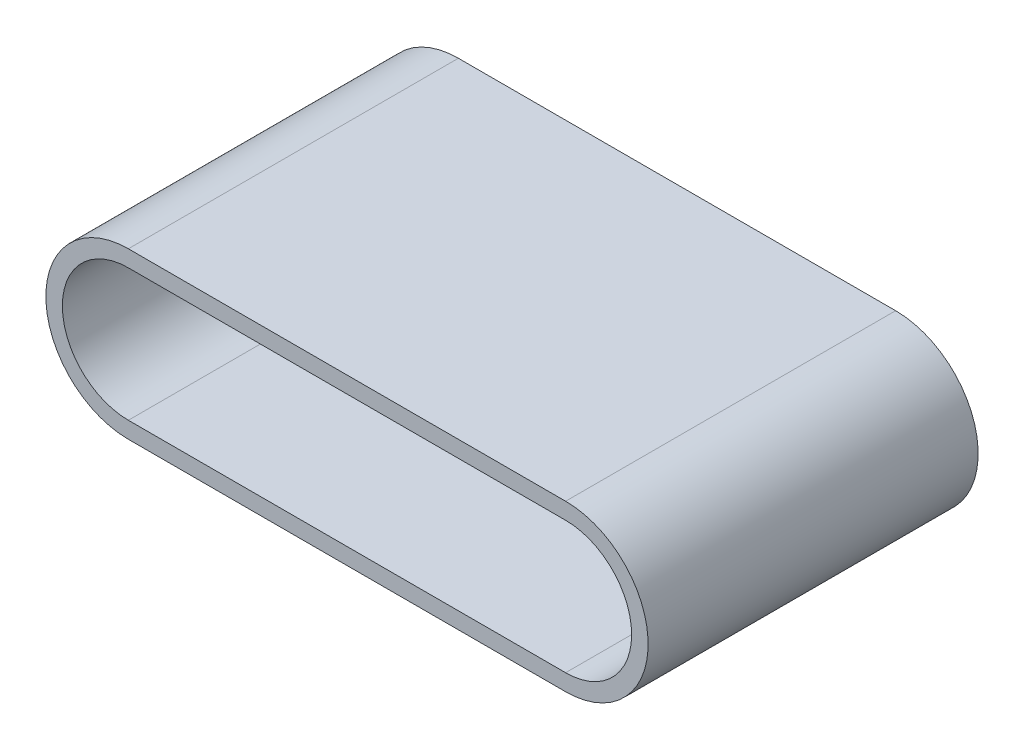
ISO-10303-21;
HEADER;
FILE_DESCRIPTION(('STEP AP214'),'2;1');
FILE_NAME('part.step','',(''),(''),'','','');
FILE_SCHEMA(('AUTOMOTIVE_DESIGN { 1 0 10303 214 1 1 1 1 }'));
ENDSEC;
DATA;
#1=APPLICATION_CONTEXT('core data for automotive mechanical design processes');
#2=APPLICATION_PROTOCOL_DEFINITION('international standard','automotive_design',2000,#1);
#3=PRODUCT_CONTEXT('',#1,'mechanical');
#4=PRODUCT('Part','Part','',(#3));
#5=PRODUCT_RELATED_PRODUCT_CATEGORY('part','',(#4));
#6=PRODUCT_DEFINITION_FORMATION('','',#4);
#7=PRODUCT_DEFINITION_CONTEXT('part definition',#1,'design');
#8=PRODUCT_DEFINITION('design','',#6,#7);
#9=PRODUCT_DEFINITION_SHAPE('','',#8);
#10=(LENGTH_UNIT() NAMED_UNIT(*) SI_UNIT(.MILLI.,.METRE.));
#11=(NAMED_UNIT(*) PLANE_ANGLE_UNIT() SI_UNIT($,.RADIAN.));
#12=(NAMED_UNIT(*) SI_UNIT($,.STERADIAN.) SOLID_ANGLE_UNIT());
#13=UNCERTAINTY_MEASURE_WITH_UNIT(LENGTH_MEASURE(1.E-05),#10,'distance_accuracy_value','');
#14=(GEOMETRIC_REPRESENTATION_CONTEXT(3) GLOBAL_UNCERTAINTY_ASSIGNED_CONTEXT((#13)) GLOBAL_UNIT_ASSIGNED_CONTEXT((#10,
#11,#12)) REPRESENTATION_CONTEXT('',''));
#15=CARTESIAN_POINT('',(0.,0.,0.));
#16=DIRECTION('',(0.,0.,1.));
#17=DIRECTION('',(1.,0.,0.));
#18=AXIS2_PLACEMENT_3D('',#15,#16,#17);
#19=CARTESIAN_POINT('',(57.4341991322256,0.,100.));
#20=DIRECTION('',(0.,0.,-1.));
#21=DIRECTION('',(-1.,0.,0.));
#22=AXIS2_PLACEMENT_3D('',#19,#20,#21);
#23=PLANE('',#22);
#24=CARTESIAN_POINT('',(57.4341991322256,0.,100.));
#25=DIRECTION('',(0.,0.,-1.));
#26=DIRECTION('',(-1.,0.,0.));
#27=AXIS2_PLACEMENT_3D('',#24,#25,#26);
#28=CIRCLE('',#27,50.);
#29=CARTESIAN_POINT('',(57.4341991322256,50.0000000000001,100.));
#30=VERTEX_POINT('',#29);
#31=CARTESIAN_POINT('',(57.4341991322256,-50.,100.));
#32=VERTEX_POINT('',#31);
#33=EDGE_CURVE('E160',#30,#32,#28,.F.);
#34=ORIENTED_EDGE('',*,*,#33,.T.);
#35=DIRECTION('',(1.,0.,0.));
#36=VECTOR('',#35,1.);
#37=CARTESIAN_POINT('',(57.4341991322256,-50.,100.));
#38=LINE('',#37,#36);
#39=CARTESIAN_POINT('',(322.434199132226,-49.9999999999999,100.));
#40=VERTEX_POINT('',#39);
#41=EDGE_CURVE('E163',#32,#40,#38,.T.);
#42=ORIENTED_EDGE('',*,*,#41,.T.);
#43=CARTESIAN_POINT('',(322.434199132226,1.02348685082632E-13,100.));
#44=DIRECTION('',(0.,0.,-1.));
#45=DIRECTION('',(-1.,0.,0.));
#46=AXIS2_PLACEMENT_3D('',#43,#44,#45);
#47=CIRCLE('',#46,50.);
#48=CARTESIAN_POINT('',(322.434199132226,50.0000000000001,100.));
#49=VERTEX_POINT('',#48);
#50=EDGE_CURVE('E166',#40,#49,#47,.F.);
#51=ORIENTED_EDGE('',*,*,#50,.T.);
#52=DIRECTION('',(-1.,0.,0.));
#53=VECTOR('',#52,1.);
#54=CARTESIAN_POINT('',(57.4341991322256,50.0000000000001,100.));
#55=LINE('',#54,#53);
#56=EDGE_CURVE('E168',#49,#30,#55,.T.);
#57=ORIENTED_EDGE('',*,*,#56,.T.);
#58=EDGE_LOOP('',(#34,#42,#51,#57));
#59=FACE_BOUND('',#58,.T.);
#60=CARTESIAN_POINT('',(57.4341991322256,0.,100.));
#61=DIRECTION('',(0.,0.,1.));
#62=DIRECTION('',(-1.,0.,0.));
#63=AXIS2_PLACEMENT_3D('',#60,#61,#62);
#64=CIRCLE('',#63,40.);
#65=CARTESIAN_POINT('',(57.4341991322256,40.0000000000001,100.));
#66=VERTEX_POINT('',#65);
#67=CARTESIAN_POINT('',(57.4341991322256,-39.9999999999999,100.));
#68=VERTEX_POINT('',#67);
#69=EDGE_CURVE('E124',#66,#68,#64,.T.);
#70=ORIENTED_EDGE('',*,*,#69,.F.);
#71=DIRECTION('',(-1.,0.,0.));
#72=VECTOR('',#71,1.);
#73=CARTESIAN_POINT('',(57.4341991322256,40.0000000000001,100.));
#74=LINE('',#73,#72);
#75=CARTESIAN_POINT('',(322.434199132226,40.0000000000001,100.));
#76=VERTEX_POINT('',#75);
#77=EDGE_CURVE('E146',#76,#66,#74,.T.);
#78=ORIENTED_EDGE('',*,*,#77,.F.);
#79=CARTESIAN_POINT('',(322.434199132226,1.02348685082632E-13,100.));
#80=DIRECTION('',(0.,0.,1.));
#81=DIRECTION('',(-1.,0.,0.));
#82=AXIS2_PLACEMENT_3D('',#79,#80,#81);
#83=CIRCLE('',#82,40.);
#84=CARTESIAN_POINT('',(322.434199132226,-39.9999999999999,100.));
#85=VERTEX_POINT('',#84);
#86=EDGE_CURVE('E144',#85,#76,#83,.T.);
#87=ORIENTED_EDGE('',*,*,#86,.F.);
#88=DIRECTION('',(1.,0.,0.));
#89=VECTOR('',#88,1.);
#90=CARTESIAN_POINT('',(322.434199132226,-39.9999999999999,100.));
#91=LINE('',#90,#89);
#92=EDGE_CURVE('E132',#68,#85,#91,.T.);
#93=ORIENTED_EDGE('',*,*,#92,.F.);
#94=EDGE_LOOP('',(#70,#78,#87,#93));
#95=FACE_BOUND('',#94,.T.);
#96=ADVANCED_FACE('F59',(#59,#95),#23,.F.);
#97=CARTESIAN_POINT('',(57.4341991322256,0.,-100.));
#98=DIRECTION('',(0.,0.,-1.));
#99=DIRECTION('',(-1.,0.,0.));
#100=AXIS2_PLACEMENT_3D('',#97,#98,#99);
#101=PLANE('',#100);
#102=CARTESIAN_POINT('',(57.4341991322256,0.,-100.));
#103=DIRECTION('',(0.,0.,-1.));
#104=DIRECTION('',(-1.,0.,0.));
#105=AXIS2_PLACEMENT_3D('',#102,#103,#104);
#106=CIRCLE('',#105,50.);
#107=CARTESIAN_POINT('',(57.4341991322256,50.0000000000001,-100.));
#108=VERTEX_POINT('',#107);
#109=CARTESIAN_POINT('',(57.4341991322256,-50.,-100.));
#110=VERTEX_POINT('',#109);
#111=EDGE_CURVE('E140',#108,#110,#106,.F.);
#112=ORIENTED_EDGE('',*,*,#111,.F.);
#113=DIRECTION('',(-1.,0.,0.));
#114=VECTOR('',#113,1.);
#115=CARTESIAN_POINT('',(57.4341991322256,50.0000000000001,-100.));
#116=LINE('',#115,#114);
#117=CARTESIAN_POINT('',(322.434199132226,50.0000000000001,-100.));
#118=VERTEX_POINT('',#117);
#119=EDGE_CURVE('E164',#118,#108,#116,.T.);
#120=ORIENTED_EDGE('',*,*,#119,.F.);
#121=CARTESIAN_POINT('',(322.434199132226,1.02348685082632E-13,-100.));
#122=DIRECTION('',(0.,0.,-1.));
#123=DIRECTION('',(-1.,0.,0.));
#124=AXIS2_PLACEMENT_3D('',#121,#122,#123);
#125=CIRCLE('',#124,50.);
#126=CARTESIAN_POINT('',(322.434199132226,-49.9999999999999,-100.));
#127=VERTEX_POINT('',#126);
#128=EDGE_CURVE('E175',#127,#118,#125,.F.);
#129=ORIENTED_EDGE('',*,*,#128,.F.);
#130=DIRECTION('',(1.,0.,0.));
#131=VECTOR('',#130,1.);
#132=CARTESIAN_POINT('',(57.4341991322256,-50.,-100.));
#133=LINE('',#132,#131);
#134=EDGE_CURVE('E173',#110,#127,#133,.T.);
#135=ORIENTED_EDGE('',*,*,#134,.F.);
#136=EDGE_LOOP('',(#112,#120,#129,#135));
#137=FACE_BOUND('',#136,.T.);
#138=DIRECTION('',(-1.,0.,0.));
#139=VECTOR('',#138,1.);
#140=CARTESIAN_POINT('',(57.4341991322256,40.0000000000001,-100.));
#141=LINE('',#140,#139);
#142=CARTESIAN_POINT('',(322.434199132226,40.0000000000001,-100.));
#143=VERTEX_POINT('',#142);
#144=CARTESIAN_POINT('',(57.4341991322256,40.0000000000001,-100.));
#145=VERTEX_POINT('',#144);
#146=EDGE_CURVE('E133',#143,#145,#141,.T.);
#147=ORIENTED_EDGE('',*,*,#146,.T.);
#148=CARTESIAN_POINT('',(57.4341991322256,0.,-100.));
#149=DIRECTION('',(0.,0.,1.));
#150=DIRECTION('',(-1.,0.,0.));
#151=AXIS2_PLACEMENT_3D('',#148,#149,#150);
#152=CIRCLE('',#151,40.);
#153=CARTESIAN_POINT('',(57.4341991322256,-39.9999999999999,-100.));
#154=VERTEX_POINT('',#153);
#155=EDGE_CURVE('E82',#145,#154,#152,.T.);
#156=ORIENTED_EDGE('',*,*,#155,.T.);
#157=DIRECTION('',(1.,0.,0.));
#158=VECTOR('',#157,1.);
#159=CARTESIAN_POINT('',(322.434199132226,-39.9999999999999,-100.));
#160=LINE('',#159,#158);
#161=CARTESIAN_POINT('',(322.434199132226,-39.9999999999999,-100.));
#162=VERTEX_POINT('',#161);
#163=EDGE_CURVE('E139',#154,#162,#160,.T.);
#164=ORIENTED_EDGE('',*,*,#163,.T.);
#165=CARTESIAN_POINT('',(322.434199132226,1.02348685082632E-13,-100.));
#166=DIRECTION('',(0.,0.,1.));
#167=DIRECTION('',(-1.,0.,0.));
#168=AXIS2_PLACEMENT_3D('',#165,#166,#167);
#169=CIRCLE('',#168,40.);
#170=EDGE_CURVE('E152',#162,#143,#169,.T.);
#171=ORIENTED_EDGE('',*,*,#170,.T.);
#172=EDGE_LOOP('',(#147,#156,#164,#171));
#173=FACE_BOUND('',#172,.T.);
#174=ADVANCED_FACE('F193',(#137,#173),#101,.T.);
#175=CARTESIAN_POINT('',(57.4341991322256,0.,100.));
#176=DIRECTION('',(0.,0.,-1.));
#177=DIRECTION('',(-1.,0.,0.));
#178=AXIS2_PLACEMENT_3D('',#175,#176,#177);
#179=CYLINDRICAL_SURFACE('',#178,50.);
#180=ORIENTED_EDGE('',*,*,#111,.T.);
#181=DIRECTION('',(0.,0.,-1.));
#182=VECTOR('',#181,1.);
#183=CARTESIAN_POINT('',(57.4341991322256,-50.,100.));
#184=LINE('',#183,#182);
#185=EDGE_CURVE('E12',#32,#110,#184,.T.);
#186=ORIENTED_EDGE('',*,*,#185,.F.);
#187=ORIENTED_EDGE('',*,*,#33,.F.);
#188=DIRECTION('',(0.,0.,-1.));
#189=VECTOR('',#188,1.);
#190=CARTESIAN_POINT('',(57.4341991322256,50.0000000000001,100.));
#191=LINE('',#190,#189);
#192=EDGE_CURVE('E170',#30,#108,#191,.T.);
#193=ORIENTED_EDGE('',*,*,#192,.T.);
#194=EDGE_LOOP('',(#180,#186,#187,#193));
#195=FACE_BOUND('',#194,.T.);
#196=ADVANCED_FACE('F61',(#195),#179,.T.);
#197=CARTESIAN_POINT('',(57.4341991322256,-50.,100.));
#198=DIRECTION('',(0.,1.,0.));
#199=DIRECTION('',(-1.,0.,0.));
#200=AXIS2_PLACEMENT_3D('',#197,#198,#199);
#201=PLANE('',#200);
#202=ORIENTED_EDGE('',*,*,#134,.T.);
#203=DIRECTION('',(0.,0.,-1.));
#204=VECTOR('',#203,1.);
#205=CARTESIAN_POINT('',(322.434199132226,-49.9999999999999,100.));
#206=LINE('',#205,#204);
#207=EDGE_CURVE('E67',#40,#127,#206,.T.);
#208=ORIENTED_EDGE('',*,*,#207,.F.);
#209=ORIENTED_EDGE('',*,*,#41,.F.);
#210=ORIENTED_EDGE('',*,*,#185,.T.);
#211=EDGE_LOOP('',(#202,#208,#209,#210));
#212=FACE_BOUND('',#211,.T.);
#213=ADVANCED_FACE('F203',(#212),#201,.F.);
#214=CARTESIAN_POINT('',(322.434199132226,1.02348685082632E-13,100.));
#215=DIRECTION('',(0.,0.,-1.));
#216=DIRECTION('',(-1.,0.,0.));
#217=AXIS2_PLACEMENT_3D('',#214,#215,#216);
#218=CYLINDRICAL_SURFACE('',#217,50.);
#219=ORIENTED_EDGE('',*,*,#128,.T.);
#220=DIRECTION('',(0.,0.,-1.));
#221=VECTOR('',#220,1.);
#222=CARTESIAN_POINT('',(322.434199132226,50.0000000000001,100.));
#223=LINE('',#222,#221);
#224=EDGE_CURVE('E180',#49,#118,#223,.T.);
#225=ORIENTED_EDGE('',*,*,#224,.F.);
#226=ORIENTED_EDGE('',*,*,#50,.F.);
#227=ORIENTED_EDGE('',*,*,#207,.T.);
#228=EDGE_LOOP('',(#219,#225,#226,#227));
#229=FACE_BOUND('',#228,.T.);
#230=ADVANCED_FACE('F187',(#229),#218,.T.);
#231=CARTESIAN_POINT('',(57.4341991322256,50.0000000000001,100.));
#232=DIRECTION('',(0.,-1.,0.));
#233=DIRECTION('',(1.,0.,0.));
#234=AXIS2_PLACEMENT_3D('',#231,#232,#233);
#235=PLANE('',#234);
#236=ORIENTED_EDGE('',*,*,#119,.T.);
#237=ORIENTED_EDGE('',*,*,#192,.F.);
#238=ORIENTED_EDGE('',*,*,#56,.F.);
#239=ORIENTED_EDGE('',*,*,#224,.T.);
#240=EDGE_LOOP('',(#236,#237,#238,#239));
#241=FACE_BOUND('',#240,.T.);
#242=ADVANCED_FACE('F197',(#241),#235,.F.);
#243=CARTESIAN_POINT('',(57.4341991322256,0.,100.));
#244=DIRECTION('',(0.,0.,-1.));
#245=DIRECTION('',(-1.,0.,0.));
#246=AXIS2_PLACEMENT_3D('',#243,#244,#245);
#247=CYLINDRICAL_SURFACE('',#246,40.);
#248=ORIENTED_EDGE('',*,*,#155,.F.);
#249=DIRECTION('',(0.,0.,-1.));
#250=VECTOR('',#249,1.);
#251=CARTESIAN_POINT('',(57.4341991322256,40.0000000000001,100.));
#252=LINE('',#251,#250);
#253=EDGE_CURVE('E128',#66,#145,#252,.T.);
#254=ORIENTED_EDGE('',*,*,#253,.F.);
#255=ORIENTED_EDGE('',*,*,#69,.T.);
#256=DIRECTION('',(0.,0.,-1.));
#257=VECTOR('',#256,1.);
#258=CARTESIAN_POINT('',(57.4341991322256,-39.9999999999999,100.));
#259=LINE('',#258,#257);
#260=EDGE_CURVE('E127',#68,#154,#259,.T.);
#261=ORIENTED_EDGE('',*,*,#260,.T.);
#262=EDGE_LOOP('',(#248,#254,#255,#261));
#263=FACE_BOUND('',#262,.T.);
#264=ADVANCED_FACE('F126',(#263),#247,.F.);
#265=CARTESIAN_POINT('',(322.434199132226,-39.9999999999999,100.));
#266=DIRECTION('',(0.,1.,0.));
#267=DIRECTION('',(-1.,0.,0.));
#268=AXIS2_PLACEMENT_3D('',#265,#266,#267);
#269=PLANE('',#268);
#270=ORIENTED_EDGE('',*,*,#163,.F.);
#271=ORIENTED_EDGE('',*,*,#260,.F.);
#272=ORIENTED_EDGE('',*,*,#92,.T.);
#273=DIRECTION('',(0.,0.,-1.));
#274=VECTOR('',#273,1.);
#275=CARTESIAN_POINT('',(322.434199132226,-39.9999999999999,100.));
#276=LINE('',#275,#274);
#277=EDGE_CURVE('E141',#85,#162,#276,.T.);
#278=ORIENTED_EDGE('',*,*,#277,.T.);
#279=EDGE_LOOP('',(#270,#271,#272,#278));
#280=FACE_BOUND('',#279,.T.);
#281=ADVANCED_FACE('F136',(#280),#269,.T.);
#282=CARTESIAN_POINT('',(322.434199132226,1.02348685082632E-13,100.));
#283=DIRECTION('',(0.,0.,-1.));
#284=DIRECTION('',(-1.,0.,0.));
#285=AXIS2_PLACEMENT_3D('',#282,#283,#284);
#286=CYLINDRICAL_SURFACE('',#285,40.);
#287=ORIENTED_EDGE('',*,*,#170,.F.);
#288=ORIENTED_EDGE('',*,*,#277,.F.);
#289=ORIENTED_EDGE('',*,*,#86,.T.);
#290=DIRECTION('',(0.,0.,-1.));
#291=VECTOR('',#290,1.);
#292=CARTESIAN_POINT('',(322.434199132226,40.0000000000001,100.));
#293=LINE('',#292,#291);
#294=EDGE_CURVE('E74',#76,#143,#293,.T.);
#295=ORIENTED_EDGE('',*,*,#294,.T.);
#296=EDGE_LOOP('',(#287,#288,#289,#295));
#297=FACE_BOUND('',#296,.T.);
#298=ADVANCED_FACE('F226',(#297),#286,.F.);
#299=CARTESIAN_POINT('',(57.4341991322256,40.0000000000001,100.));
#300=DIRECTION('',(0.,-1.,0.));
#301=DIRECTION('',(1.,0.,0.));
#302=AXIS2_PLACEMENT_3D('',#299,#300,#301);
#303=PLANE('',#302);
#304=ORIENTED_EDGE('',*,*,#146,.F.);
#305=ORIENTED_EDGE('',*,*,#294,.F.);
#306=ORIENTED_EDGE('',*,*,#77,.T.);
#307=ORIENTED_EDGE('',*,*,#253,.T.);
#308=EDGE_LOOP('',(#304,#305,#306,#307));
#309=FACE_BOUND('',#308,.T.);
#310=ADVANCED_FACE('F230',(#309),#303,.T.);
#311=CLOSED_SHELL('',(#96,#174,#196,#213,#230,#242,#264,#281,#298,#310));
#312=MANIFOLD_SOLID_BREP('B2',#311);
#313=ADVANCED_BREP_SHAPE_REPRESENTATION('',(#18,#312),#14);
#314=SHAPE_DEFINITION_REPRESENTATION(#9,#313);
ENDSEC;
END-ISO-10303-21;
